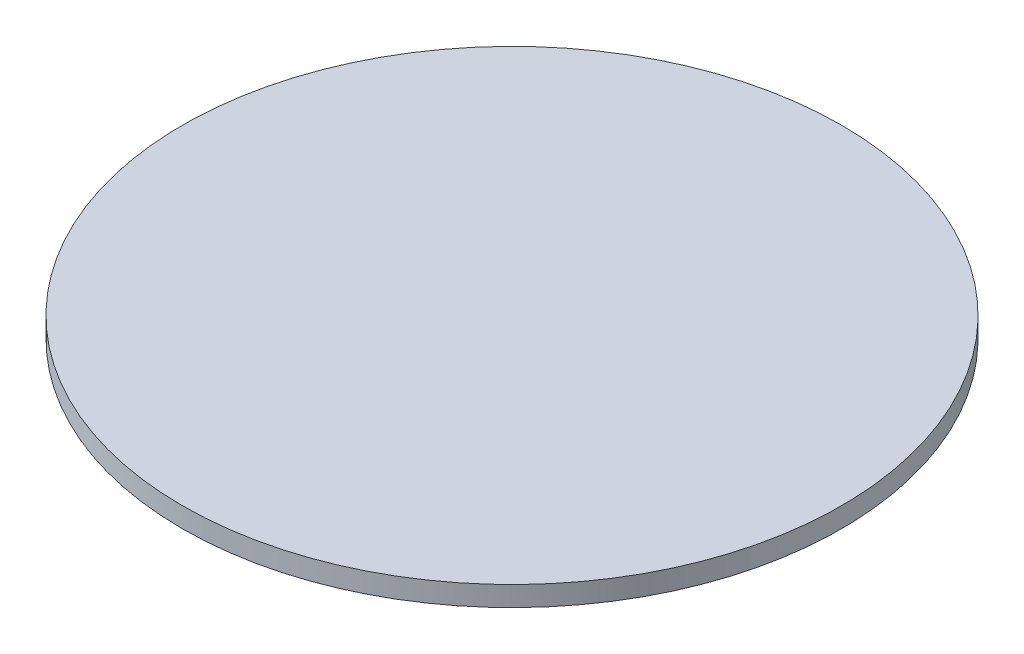
ISO-10303-21;
HEADER;
FILE_DESCRIPTION(('STEP AP214'),'2;1');
FILE_NAME('part.step','',(''),(''),'','','');
FILE_SCHEMA(('AUTOMOTIVE_DESIGN { 1 0 10303 214 1 1 1 1 }'));
ENDSEC;
DATA;
#1=APPLICATION_CONTEXT('core data for automotive mechanical design processes');
#2=APPLICATION_PROTOCOL_DEFINITION('international standard','automotive_design',2000,#1);
#3=PRODUCT_CONTEXT('',#1,'mechanical');
#4=PRODUCT('Part','Part','',(#3));
#5=PRODUCT_RELATED_PRODUCT_CATEGORY('part','',(#4));
#6=PRODUCT_DEFINITION_FORMATION('','',#4);
#7=PRODUCT_DEFINITION_CONTEXT('part definition',#1,'design');
#8=PRODUCT_DEFINITION('design','',#6,#7);
#9=PRODUCT_DEFINITION_SHAPE('','',#8);
#10=(LENGTH_UNIT() NAMED_UNIT(*) SI_UNIT(.MILLI.,.METRE.));
#11=(NAMED_UNIT(*) PLANE_ANGLE_UNIT() SI_UNIT($,.RADIAN.));
#12=(NAMED_UNIT(*) SI_UNIT($,.STERADIAN.) SOLID_ANGLE_UNIT());
#13=UNCERTAINTY_MEASURE_WITH_UNIT(LENGTH_MEASURE(1.E-05),#10,'distance_accuracy_value','');
#14=(GEOMETRIC_REPRESENTATION_CONTEXT(3) GLOBAL_UNCERTAINTY_ASSIGNED_CONTEXT((#13)) GLOBAL_UNIT_ASSIGNED_CONTEXT((#10,
#11,#12)) REPRESENTATION_CONTEXT('',''));
#15=CARTESIAN_POINT('',(0.,0.,0.));
#16=DIRECTION('',(0.,0.,1.));
#17=DIRECTION('',(1.,0.,0.));
#18=AXIS2_PLACEMENT_3D('',#15,#16,#17);
#19=CARTESIAN_POINT('',(0.,2.54,0.));
#20=DIRECTION('',(0.,-1.,0.));
#21=DIRECTION('',(0.,0.,-1.));
#22=AXIS2_PLACEMENT_3D('',#19,#20,#21);
#23=CYLINDRICAL_SURFACE('',#22,41.8567872825562);
#24=CARTESIAN_POINT('',(0.,2.54,0.));
#25=DIRECTION('',(0.,1.,0.));
#26=DIRECTION('',(0.,0.,1.));
#27=AXIS2_PLACEMENT_3D('',#24,#25,#26);
#28=CIRCLE('',#27,41.8567872825562);
#29=CARTESIAN_POINT('',(0.,2.54,41.8567872825562));
#30=VERTEX_POINT('',#29);
#31=EDGE_CURVE('E10',#30,#30,#28,.T.);
#32=ORIENTED_EDGE('',*,*,#31,.F.);
#33=EDGE_LOOP('',(#32));
#34=FACE_BOUND('',#33,.T.);
#35=CARTESIAN_POINT('',(0.,0.,0.));
#36=DIRECTION('',(0.,1.,0.));
#37=DIRECTION('',(0.,0.,1.));
#38=AXIS2_PLACEMENT_3D('',#35,#36,#37);
#39=CIRCLE('',#38,41.8567872825562);
#40=CARTESIAN_POINT('',(0.,0.,41.8567872825562));
#41=VERTEX_POINT('',#40);
#42=EDGE_CURVE('E34',#41,#41,#39,.T.);
#43=ORIENTED_EDGE('',*,*,#42,.T.);
#44=EDGE_LOOP('',(#43));
#45=FACE_BOUND('',#44,.T.);
#46=ADVANCED_FACE('F31',(#34,#45),#23,.T.);
#47=CARTESIAN_POINT('',(0.,2.54,0.));
#48=DIRECTION('',(0.,1.,0.));
#49=DIRECTION('',(0.,0.,1.));
#50=AXIS2_PLACEMENT_3D('',#47,#48,#49);
#51=PLANE('',#50);
#52=ORIENTED_EDGE('',*,*,#31,.T.);
#53=EDGE_LOOP('',(#52));
#54=FACE_BOUND('',#53,.T.);
#55=ADVANCED_FACE('F46',(#54),#51,.T.);
#56=CARTESIAN_POINT('',(0.,0.,0.));
#57=DIRECTION('',(0.,1.,0.));
#58=DIRECTION('',(0.,0.,1.));
#59=AXIS2_PLACEMENT_3D('',#56,#57,#58);
#60=PLANE('',#59);
#61=ORIENTED_EDGE('',*,*,#42,.F.);
#62=EDGE_LOOP('',(#61));
#63=FACE_BOUND('',#62,.T.);
#64=ADVANCED_FACE('F44',(#63),#60,.F.);
#65=CLOSED_SHELL('',(#46,#55,#64));
#66=MANIFOLD_SOLID_BREP('B2',#65);
#67=ADVANCED_BREP_SHAPE_REPRESENTATION('',(#18,#66),#14);
#68=SHAPE_DEFINITION_REPRESENTATION(#9,#67);
ENDSEC;
END-ISO-10303-21;
